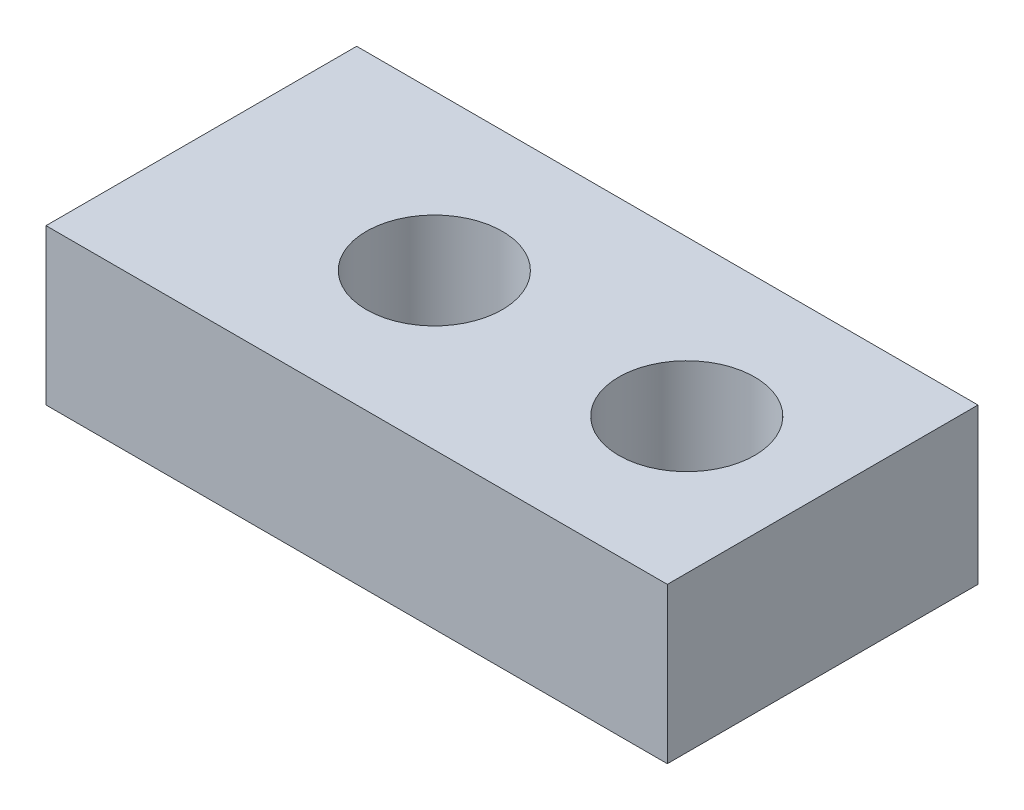
ISO-10303-21;
HEADER;
FILE_DESCRIPTION(('STEP AP214'),'2;1');
FILE_NAME('part.step','',(''),(''),'','','');
FILE_SCHEMA(('AUTOMOTIVE_DESIGN { 1 0 10303 214 1 1 1 1 }'));
ENDSEC;
DATA;
#1=APPLICATION_CONTEXT('core data for automotive mechanical design processes');
#2=APPLICATION_PROTOCOL_DEFINITION('international standard','automotive_design',2000,#1);
#3=PRODUCT_CONTEXT('',#1,'mechanical');
#4=PRODUCT('Part','Part','',(#3));
#5=PRODUCT_RELATED_PRODUCT_CATEGORY('part','',(#4));
#6=PRODUCT_DEFINITION_FORMATION('','',#4);
#7=PRODUCT_DEFINITION_CONTEXT('part definition',#1,'design');
#8=PRODUCT_DEFINITION('design','',#6,#7);
#9=PRODUCT_DEFINITION_SHAPE('','',#8);
#10=(LENGTH_UNIT() NAMED_UNIT(*) SI_UNIT(.MILLI.,.METRE.));
#11=(NAMED_UNIT(*) PLANE_ANGLE_UNIT() SI_UNIT($,.RADIAN.));
#12=(NAMED_UNIT(*) SI_UNIT($,.STERADIAN.) SOLID_ANGLE_UNIT());
#13=UNCERTAINTY_MEASURE_WITH_UNIT(LENGTH_MEASURE(1.E-05),#10,'distance_accuracy_value','');
#14=(GEOMETRIC_REPRESENTATION_CONTEXT(3) GLOBAL_UNCERTAINTY_ASSIGNED_CONTEXT((#13)) GLOBAL_UNIT_ASSIGNED_CONTEXT((#10,
#11,#12)) REPRESENTATION_CONTEXT('',''));
#15=CARTESIAN_POINT('',(0.,0.,0.));
#16=DIRECTION('',(0.,0.,1.));
#17=DIRECTION('',(1.,0.,0.));
#18=AXIS2_PLACEMENT_3D('',#15,#16,#17);
#19=CARTESIAN_POINT('',(0.,6.35,0.));
#20=DIRECTION('',(1.,0.,0.));
#21=DIRECTION('',(0.,0.,-1.));
#22=AXIS2_PLACEMENT_3D('',#19,#20,#21);
#23=PLANE('',#22);
#24=DIRECTION('',(0.,0.,1.));
#25=VECTOR('',#24,1.);
#26=CARTESIAN_POINT('',(0.,0.,0.));
#27=LINE('',#26,#25);
#28=CARTESIAN_POINT('',(0.,0.,-12.7));
#29=VERTEX_POINT('',#28);
#30=CARTESIAN_POINT('',(0.,0.,0.));
#31=VERTEX_POINT('',#30);
#32=EDGE_CURVE('E105',#29,#31,#27,.T.);
#33=ORIENTED_EDGE('',*,*,#32,.T.);
#34=DIRECTION('',(0.,-1.,0.));
#35=VECTOR('',#34,1.);
#36=CARTESIAN_POINT('',(0.,6.35,0.));
#37=LINE('',#36,#35);
#38=CARTESIAN_POINT('',(0.,6.35,0.));
#39=VERTEX_POINT('',#38);
#40=EDGE_CURVE('E11',#39,#31,#37,.T.);
#41=ORIENTED_EDGE('',*,*,#40,.F.);
#42=DIRECTION('',(0.,0.,1.));
#43=VECTOR('',#42,1.);
#44=CARTESIAN_POINT('',(0.,6.35,0.));
#45=LINE('',#44,#43);
#46=CARTESIAN_POINT('',(0.,6.35,-12.7));
#47=VERTEX_POINT('',#46);
#48=EDGE_CURVE('E89',#47,#39,#45,.T.);
#49=ORIENTED_EDGE('',*,*,#48,.F.);
#50=DIRECTION('',(0.,-1.,0.));
#51=VECTOR('',#50,1.);
#52=CARTESIAN_POINT('',(0.,6.35,-12.7));
#53=LINE('',#52,#51);
#54=EDGE_CURVE('E98',#47,#29,#53,.T.);
#55=ORIENTED_EDGE('',*,*,#54,.T.);
#56=EDGE_LOOP('',(#33,#41,#49,#55));
#57=FACE_BOUND('',#56,.T.);
#58=ADVANCED_FACE('F39',(#57),#23,.F.);
#59=CARTESIAN_POINT('',(0.,6.35,0.));
#60=DIRECTION('',(0.,0.,-1.));
#61=DIRECTION('',(-1.,0.,0.));
#62=AXIS2_PLACEMENT_3D('',#59,#60,#61);
#63=PLANE('',#62);
#64=DIRECTION('',(1.,0.,0.));
#65=VECTOR('',#64,1.);
#66=CARTESIAN_POINT('',(0.,0.,0.));
#67=LINE('',#66,#65);
#68=CARTESIAN_POINT('',(25.4,0.,0.));
#69=VERTEX_POINT('',#68);
#70=EDGE_CURVE('E94',#31,#69,#67,.T.);
#71=ORIENTED_EDGE('',*,*,#70,.T.);
#72=DIRECTION('',(0.,-1.,0.));
#73=VECTOR('',#72,1.);
#74=CARTESIAN_POINT('',(25.4,6.35,0.));
#75=LINE('',#74,#73);
#76=CARTESIAN_POINT('',(25.4,6.35,0.));
#77=VERTEX_POINT('',#76);
#78=EDGE_CURVE('E50',#77,#69,#75,.T.);
#79=ORIENTED_EDGE('',*,*,#78,.F.);
#80=DIRECTION('',(1.,0.,0.));
#81=VECTOR('',#80,1.);
#82=CARTESIAN_POINT('',(0.,6.35,0.));
#83=LINE('',#82,#81);
#84=EDGE_CURVE('E83',#39,#77,#83,.T.);
#85=ORIENTED_EDGE('',*,*,#84,.F.);
#86=ORIENTED_EDGE('',*,*,#40,.T.);
#87=EDGE_LOOP('',(#71,#79,#85,#86));
#88=FACE_BOUND('',#87,.T.);
#89=ADVANCED_FACE('F91',(#88),#63,.F.);
#90=CARTESIAN_POINT('',(25.4,6.35,0.));
#91=DIRECTION('',(-1.,0.,0.));
#92=DIRECTION('',(0.,0.,1.));
#93=AXIS2_PLACEMENT_3D('',#90,#91,#92);
#94=PLANE('',#93);
#95=DIRECTION('',(0.,0.,-1.));
#96=VECTOR('',#95,1.);
#97=CARTESIAN_POINT('',(25.4,0.,0.));
#98=LINE('',#97,#96);
#99=CARTESIAN_POINT('',(25.4,0.,-12.7));
#100=VERTEX_POINT('',#99);
#101=EDGE_CURVE('E75',#69,#100,#98,.T.);
#102=ORIENTED_EDGE('',*,*,#101,.T.);
#103=DIRECTION('',(0.,-1.,0.));
#104=VECTOR('',#103,1.);
#105=CARTESIAN_POINT('',(25.4,6.35,-12.7));
#106=LINE('',#105,#104);
#107=CARTESIAN_POINT('',(25.4,6.35,-12.7));
#108=VERTEX_POINT('',#107);
#109=EDGE_CURVE('E92',#108,#100,#106,.T.);
#110=ORIENTED_EDGE('',*,*,#109,.F.);
#111=DIRECTION('',(0.,0.,-1.));
#112=VECTOR('',#111,1.);
#113=CARTESIAN_POINT('',(25.4,6.35,0.));
#114=LINE('',#113,#112);
#115=EDGE_CURVE('E86',#77,#108,#114,.T.);
#116=ORIENTED_EDGE('',*,*,#115,.F.);
#117=ORIENTED_EDGE('',*,*,#78,.T.);
#118=EDGE_LOOP('',(#102,#110,#116,#117));
#119=FACE_BOUND('',#118,.T.);
#120=ADVANCED_FACE('F96',(#119),#94,.F.);
#121=CARTESIAN_POINT('',(0.,6.35,-12.7));
#122=DIRECTION('',(0.,0.,1.));
#123=DIRECTION('',(1.,0.,0.));
#124=AXIS2_PLACEMENT_3D('',#121,#122,#123);
#125=PLANE('',#124);
#126=DIRECTION('',(-1.,0.,0.));
#127=VECTOR('',#126,1.);
#128=CARTESIAN_POINT('',(0.,0.,-12.7));
#129=LINE('',#128,#127);
#130=EDGE_CURVE('E79',#100,#29,#129,.T.);
#131=ORIENTED_EDGE('',*,*,#130,.T.);
#132=ORIENTED_EDGE('',*,*,#54,.F.);
#133=DIRECTION('',(-1.,0.,0.));
#134=VECTOR('',#133,1.);
#135=CARTESIAN_POINT('',(0.,6.35,-12.7));
#136=LINE('',#135,#134);
#137=EDGE_CURVE('E54',#108,#47,#136,.T.);
#138=ORIENTED_EDGE('',*,*,#137,.F.);
#139=ORIENTED_EDGE('',*,*,#109,.T.);
#140=EDGE_LOOP('',(#131,#132,#138,#139));
#141=FACE_BOUND('',#140,.T.);
#142=ADVANCED_FACE('F109',(#141),#125,.F.);
#143=CARTESIAN_POINT('',(0.,6.35,0.));
#144=DIRECTION('',(0.,-1.,0.));
#145=DIRECTION('',(0.,0.,-1.));
#146=AXIS2_PLACEMENT_3D('',#143,#144,#145);
#147=PLANE('',#146);
#148=CARTESIAN_POINT('',(19.84375,6.35,-6.35));
#149=DIRECTION('',(0.,1.,0.));
#150=DIRECTION('',(0.,0.,1.));
#151=AXIS2_PLACEMENT_3D('',#148,#149,#150);
#152=CIRCLE('',#151,2.778125);
#153=CARTESIAN_POINT('',(19.84375,6.35,-3.571875));
#154=VERTEX_POINT('',#153);
#155=EDGE_CURVE('E125',#154,#154,#152,.T.);
#156=ORIENTED_EDGE('',*,*,#155,.F.);
#157=EDGE_LOOP('',(#156));
#158=FACE_BOUND('',#157,.T.);
#159=CARTESIAN_POINT('',(9.525,6.35,-6.35));
#160=DIRECTION('',(0.,1.,0.));
#161=DIRECTION('',(0.,0.,1.));
#162=AXIS2_PLACEMENT_3D('',#159,#160,#161);
#163=CIRCLE('',#162,2.778125);
#164=CARTESIAN_POINT('',(9.525,6.35,-3.571875));
#165=VERTEX_POINT('',#164);
#166=EDGE_CURVE('E116',#165,#165,#163,.T.);
#167=ORIENTED_EDGE('',*,*,#166,.F.);
#168=EDGE_LOOP('',(#167));
#169=FACE_BOUND('',#168,.T.);
#170=ORIENTED_EDGE('',*,*,#48,.T.);
#171=ORIENTED_EDGE('',*,*,#84,.T.);
#172=ORIENTED_EDGE('',*,*,#115,.T.);
#173=ORIENTED_EDGE('',*,*,#137,.T.);
#174=EDGE_LOOP('',(#170,#171,#172,#173));
#175=FACE_BOUND('',#174,.T.);
#176=ADVANCED_FACE('F88',(#158,#169,#175),#147,.F.);
#177=CARTESIAN_POINT('',(0.,0.,0.));
#178=DIRECTION('',(0.,-1.,0.));
#179=DIRECTION('',(0.,0.,-1.));
#180=AXIS2_PLACEMENT_3D('',#177,#178,#179);
#181=PLANE('',#180);
#182=CARTESIAN_POINT('',(19.84375,0.,-6.35));
#183=DIRECTION('',(0.,1.,0.));
#184=DIRECTION('',(0.,0.,1.));
#185=AXIS2_PLACEMENT_3D('',#182,#183,#184);
#186=CIRCLE('',#185,2.778125);
#187=CARTESIAN_POINT('',(19.84375,0.,-3.571875));
#188=VERTEX_POINT('',#187);
#189=EDGE_CURVE('E104',#188,#188,#186,.T.);
#190=ORIENTED_EDGE('',*,*,#189,.T.);
#191=EDGE_LOOP('',(#190));
#192=FACE_BOUND('',#191,.T.);
#193=CARTESIAN_POINT('',(9.525,0.,-6.35));
#194=DIRECTION('',(0.,1.,0.));
#195=DIRECTION('',(0.,0.,1.));
#196=AXIS2_PLACEMENT_3D('',#193,#194,#195);
#197=CIRCLE('',#196,2.778125);
#198=CARTESIAN_POINT('',(9.525,0.,-3.571875));
#199=VERTEX_POINT('',#198);
#200=EDGE_CURVE('E117',#199,#199,#197,.T.);
#201=ORIENTED_EDGE('',*,*,#200,.T.);
#202=EDGE_LOOP('',(#201));
#203=FACE_BOUND('',#202,.T.);
#204=ORIENTED_EDGE('',*,*,#32,.F.);
#205=ORIENTED_EDGE('',*,*,#130,.F.);
#206=ORIENTED_EDGE('',*,*,#101,.F.);
#207=ORIENTED_EDGE('',*,*,#70,.F.);
#208=EDGE_LOOP('',(#204,#205,#206,#207));
#209=FACE_BOUND('',#208,.T.);
#210=ADVANCED_FACE('F114',(#192,#203,#209),#181,.T.);
#211=CARTESIAN_POINT('',(9.525,0.,-6.35));
#212=DIRECTION('',(0.,1.,0.));
#213=DIRECTION('',(0.,0.,1.));
#214=AXIS2_PLACEMENT_3D('',#211,#212,#213);
#215=CYLINDRICAL_SURFACE('',#214,2.778125);
#216=ORIENTED_EDGE('',*,*,#200,.F.);
#217=EDGE_LOOP('',(#216));
#218=FACE_BOUND('',#217,.T.);
#219=ORIENTED_EDGE('',*,*,#166,.T.);
#220=EDGE_LOOP('',(#219));
#221=FACE_BOUND('',#220,.T.);
#222=ADVANCED_FACE('F134',(#218,#221),#215,.F.);
#223=CARTESIAN_POINT('',(19.84375,0.,-6.35));
#224=DIRECTION('',(0.,1.,0.));
#225=DIRECTION('',(0.,0.,1.));
#226=AXIS2_PLACEMENT_3D('',#223,#224,#225);
#227=CYLINDRICAL_SURFACE('',#226,2.778125);
#228=ORIENTED_EDGE('',*,*,#189,.F.);
#229=EDGE_LOOP('',(#228));
#230=FACE_BOUND('',#229,.T.);
#231=ORIENTED_EDGE('',*,*,#155,.T.);
#232=EDGE_LOOP('',(#231));
#233=FACE_BOUND('',#232,.T.);
#234=ADVANCED_FACE('F128',(#230,#233),#227,.F.);
#235=CLOSED_SHELL('',(#58,#89,#120,#142,#176,#210,#222,#234));
#236=MANIFOLD_SOLID_BREP('B2',#235);
#237=ADVANCED_BREP_SHAPE_REPRESENTATION('',(#18,#236),#14);
#238=SHAPE_DEFINITION_REPRESENTATION(#9,#237);
ENDSEC;
END-ISO-10303-21;
